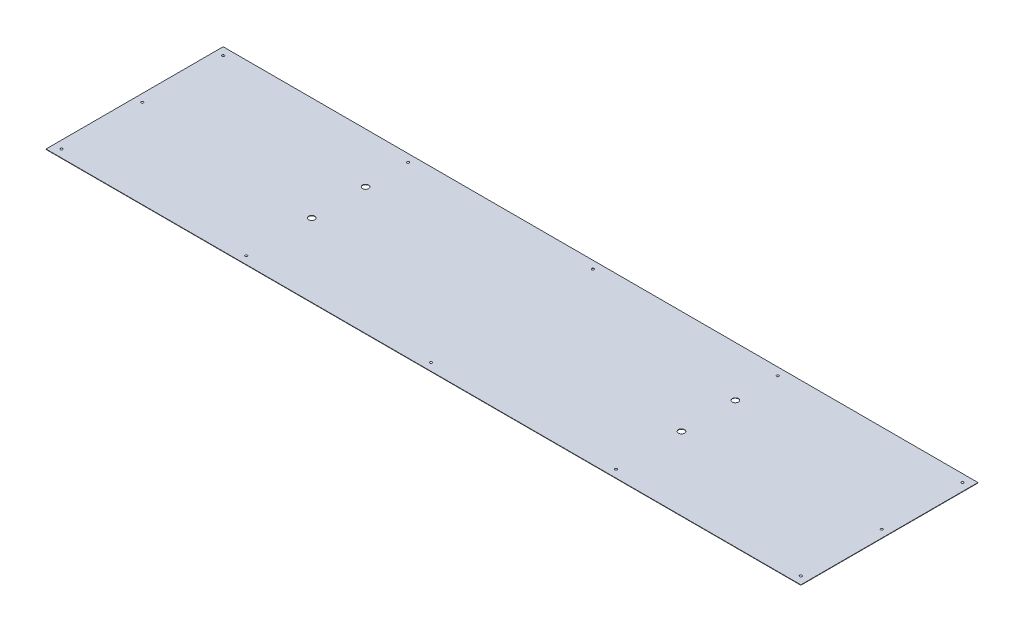
ISO-10303-21;
HEADER;
FILE_DESCRIPTION(('STEP AP214'),'2;1');
FILE_NAME('part.step','',(''),(''),'','','');
FILE_SCHEMA(('AUTOMOTIVE_DESIGN { 1 0 10303 214 1 1 1 1 }'));
ENDSEC;
DATA;
#1=APPLICATION_CONTEXT('core data for automotive mechanical design processes');
#2=APPLICATION_PROTOCOL_DEFINITION('international standard','automotive_design',2000,#1);
#3=PRODUCT_CONTEXT('',#1,'mechanical');
#4=PRODUCT('Part','Part','',(#3));
#5=PRODUCT_RELATED_PRODUCT_CATEGORY('part','',(#4));
#6=PRODUCT_DEFINITION_FORMATION('','',#4);
#7=PRODUCT_DEFINITION_CONTEXT('part definition',#1,'design');
#8=PRODUCT_DEFINITION('design','',#6,#7);
#9=PRODUCT_DEFINITION_SHAPE('','',#8);
#10=(LENGTH_UNIT() NAMED_UNIT(*) SI_UNIT(.MILLI.,.METRE.));
#11=(NAMED_UNIT(*) PLANE_ANGLE_UNIT() SI_UNIT($,.RADIAN.));
#12=(NAMED_UNIT(*) SI_UNIT($,.STERADIAN.) SOLID_ANGLE_UNIT());
#13=UNCERTAINTY_MEASURE_WITH_UNIT(LENGTH_MEASURE(1.E-05),#10,'distance_accuracy_value','');
#14=(GEOMETRIC_REPRESENTATION_CONTEXT(3) GLOBAL_UNCERTAINTY_ASSIGNED_CONTEXT((#13)) GLOBAL_UNIT_ASSIGNED_CONTEXT((#10,
#11,#12)) REPRESENTATION_CONTEXT('',''));
#15=CARTESIAN_POINT('',(0.,0.,0.));
#16=DIRECTION('',(0.,0.,1.));
#17=DIRECTION('',(1.,0.,0.));
#18=AXIS2_PLACEMENT_3D('',#15,#16,#17);
#19=CARTESIAN_POINT('',(-980.,1.,-230.));
#20=DIRECTION('',(1.,0.,0.));
#21=DIRECTION('',(0.,0.,-1.));
#22=AXIS2_PLACEMENT_3D('',#19,#20,#21);
#23=PLANE('',#22);
#24=DIRECTION('',(0.,0.,1.));
#25=VECTOR('',#24,1.);
#26=CARTESIAN_POINT('',(-980.,0.,-230.));
#27=LINE('',#26,#25);
#28=CARTESIAN_POINT('',(-980.,0.,-230.));
#29=VERTEX_POINT('',#28);
#30=CARTESIAN_POINT('',(-980.,0.,230.));
#31=VERTEX_POINT('',#30);
#32=EDGE_CURVE('E112',#29,#31,#27,.T.);
#33=ORIENTED_EDGE('',*,*,#32,.T.);
#34=DIRECTION('',(0.,-1.,0.));
#35=VECTOR('',#34,1.);
#36=CARTESIAN_POINT('',(-980.,1.,230.));
#37=LINE('',#36,#35);
#38=CARTESIAN_POINT('',(-980.,1.,230.));
#39=VERTEX_POINT('',#38);
#40=EDGE_CURVE('E101',#39,#31,#37,.T.);
#41=ORIENTED_EDGE('',*,*,#40,.F.);
#42=DIRECTION('',(0.,0.,1.));
#43=VECTOR('',#42,1.);
#44=CARTESIAN_POINT('',(-980.,1.,-230.));
#45=LINE('',#44,#43);
#46=CARTESIAN_POINT('',(-980.,1.,-230.));
#47=VERTEX_POINT('',#46);
#48=EDGE_CURVE('E93',#47,#39,#45,.T.);
#49=ORIENTED_EDGE('',*,*,#48,.F.);
#50=DIRECTION('',(0.,-1.,0.));
#51=VECTOR('',#50,1.);
#52=CARTESIAN_POINT('',(-980.,1.,-230.));
#53=LINE('',#52,#51);
#54=EDGE_CURVE('E108',#47,#29,#53,.T.);
#55=ORIENTED_EDGE('',*,*,#54,.T.);
#56=EDGE_LOOP('',(#33,#41,#49,#55));
#57=FACE_BOUND('',#56,.T.);
#58=ADVANCED_FACE('F39',(#57),#23,.F.);
#59=CARTESIAN_POINT('',(980.,1.,230.));
#60=DIRECTION('',(0.,0.,-1.));
#61=DIRECTION('',(-1.,0.,0.));
#62=AXIS2_PLACEMENT_3D('',#59,#60,#61);
#63=PLANE('',#62);
#64=DIRECTION('',(1.,0.,0.));
#65=VECTOR('',#64,1.);
#66=CARTESIAN_POINT('',(980.,0.,230.));
#67=LINE('',#66,#65);
#68=CARTESIAN_POINT('',(980.,0.,230.));
#69=VERTEX_POINT('',#68);
#70=EDGE_CURVE('E99',#31,#69,#67,.T.);
#71=ORIENTED_EDGE('',*,*,#70,.T.);
#72=DIRECTION('',(0.,-1.,0.));
#73=VECTOR('',#72,1.);
#74=CARTESIAN_POINT('',(980.,1.,230.));
#75=LINE('',#74,#73);
#76=CARTESIAN_POINT('',(980.,1.,230.));
#77=VERTEX_POINT('',#76);
#78=EDGE_CURVE('E97',#77,#69,#75,.T.);
#79=ORIENTED_EDGE('',*,*,#78,.F.);
#80=DIRECTION('',(1.,0.,0.));
#81=VECTOR('',#80,1.);
#82=CARTESIAN_POINT('',(980.,1.,230.));
#83=LINE('',#82,#81);
#84=EDGE_CURVE('E88',#39,#77,#83,.T.);
#85=ORIENTED_EDGE('',*,*,#84,.F.);
#86=ORIENTED_EDGE('',*,*,#40,.T.);
#87=EDGE_LOOP('',(#71,#79,#85,#86));
#88=FACE_BOUND('',#87,.T.);
#89=ADVANCED_FACE('F98',(#88),#63,.F.);
#90=CARTESIAN_POINT('',(980.,1.,-230.));
#91=DIRECTION('',(-1.,0.,0.));
#92=DIRECTION('',(0.,0.,1.));
#93=AXIS2_PLACEMENT_3D('',#90,#91,#92);
#94=PLANE('',#93);
#95=DIRECTION('',(0.,0.,-1.));
#96=VECTOR('',#95,1.);
#97=CARTESIAN_POINT('',(980.,0.,-230.));
#98=LINE('',#97,#96);
#99=CARTESIAN_POINT('',(980.,0.,-230.));
#100=VERTEX_POINT('',#99);
#101=EDGE_CURVE('E74',#69,#100,#98,.T.);
#102=ORIENTED_EDGE('',*,*,#101,.T.);
#103=DIRECTION('',(0.,-1.,0.));
#104=VECTOR('',#103,1.);
#105=CARTESIAN_POINT('',(980.,1.,-230.));
#106=LINE('',#105,#104);
#107=CARTESIAN_POINT('',(980.,1.,-230.));
#108=VERTEX_POINT('',#107);
#109=EDGE_CURVE('E102',#108,#100,#106,.T.);
#110=ORIENTED_EDGE('',*,*,#109,.F.);
#111=DIRECTION('',(0.,0.,-1.));
#112=VECTOR('',#111,1.);
#113=CARTESIAN_POINT('',(980.,1.,-230.));
#114=LINE('',#113,#112);
#115=EDGE_CURVE('E91',#77,#108,#114,.T.);
#116=ORIENTED_EDGE('',*,*,#115,.F.);
#117=ORIENTED_EDGE('',*,*,#78,.T.);
#118=EDGE_LOOP('',(#102,#110,#116,#117));
#119=FACE_BOUND('',#118,.T.);
#120=ADVANCED_FACE('F104',(#119),#94,.F.);
#121=CARTESIAN_POINT('',(980.,1.,-230.));
#122=DIRECTION('',(0.,0.,1.));
#123=DIRECTION('',(1.,0.,0.));
#124=AXIS2_PLACEMENT_3D('',#121,#122,#123);
#125=PLANE('',#124);
#126=DIRECTION('',(-1.,0.,0.));
#127=VECTOR('',#126,1.);
#128=CARTESIAN_POINT('',(980.,0.,-230.));
#129=LINE('',#128,#127);
#130=EDGE_CURVE('E80',#100,#29,#129,.T.);
#131=ORIENTED_EDGE('',*,*,#130,.T.);
#132=ORIENTED_EDGE('',*,*,#54,.F.);
#133=DIRECTION('',(-1.,0.,0.));
#134=VECTOR('',#133,1.);
#135=CARTESIAN_POINT('',(980.,1.,-230.));
#136=LINE('',#135,#134);
#137=EDGE_CURVE('E57',#108,#47,#136,.T.);
#138=ORIENTED_EDGE('',*,*,#137,.F.);
#139=ORIENTED_EDGE('',*,*,#109,.T.);
#140=EDGE_LOOP('',(#131,#132,#138,#139));
#141=FACE_BOUND('',#140,.T.);
#142=ADVANCED_FACE('F202',(#141),#125,.F.);
#143=CARTESIAN_POINT('',(0.,1.,0.));
#144=DIRECTION('',(0.,-1.,0.));
#145=DIRECTION('',(0.,0.,-1.));
#146=AXIS2_PLACEMENT_3D('',#143,#144,#145);
#147=PLANE('',#146);
#148=CARTESIAN_POINT('',(-960.,1.,210.));
#149=DIRECTION('',(0.,1.,0.));
#150=DIRECTION('',(0.,0.,1.));
#151=AXIS2_PLACEMENT_3D('',#148,#149,#150);
#152=CIRCLE('',#151,3.00000000000005);
#153=CARTESIAN_POINT('',(-960.,1.,213.));
#154=VERTEX_POINT('',#153);
#155=EDGE_CURVE('E262',#154,#154,#152,.T.);
#156=ORIENTED_EDGE('',*,*,#155,.F.);
#157=EDGE_LOOP('',(#156));
#158=FACE_BOUND('',#157,.T.);
#159=CARTESIAN_POINT('',(-960.,1.,-210.));
#160=DIRECTION('',(0.,1.,0.));
#161=DIRECTION('',(0.,0.,1.));
#162=AXIS2_PLACEMENT_3D('',#159,#160,#161);
#163=CIRCLE('',#162,3.00000000000005);
#164=CARTESIAN_POINT('',(-960.,1.,-207.));
#165=VERTEX_POINT('',#164);
#166=EDGE_CURVE('E280',#165,#165,#163,.T.);
#167=ORIENTED_EDGE('',*,*,#166,.F.);
#168=EDGE_LOOP('',(#167));
#169=FACE_BOUND('',#168,.T.);
#170=CARTESIAN_POINT('',(960.,1.,-210.));
#171=DIRECTION('',(0.,1.,0.));
#172=DIRECTION('',(0.,0.,1.));
#173=AXIS2_PLACEMENT_3D('',#170,#171,#172);
#174=CIRCLE('',#173,3.00000000000005);
#175=CARTESIAN_POINT('',(960.,1.,-207.));
#176=VERTEX_POINT('',#175);
#177=EDGE_CURVE('E285',#176,#176,#174,.T.);
#178=ORIENTED_EDGE('',*,*,#177,.F.);
#179=EDGE_LOOP('',(#178));
#180=FACE_BOUND('',#179,.T.);
#181=CARTESIAN_POINT('',(-960.,1.,0.));
#182=DIRECTION('',(0.,1.,0.));
#183=DIRECTION('',(0.,0.,1.));
#184=AXIS2_PLACEMENT_3D('',#181,#182,#183);
#185=CIRCLE('',#184,3.00000000000005);
#186=CARTESIAN_POINT('',(-960.,1.,3.00000000000002));
#187=VERTEX_POINT('',#186);
#188=EDGE_CURVE('E287',#187,#187,#185,.T.);
#189=ORIENTED_EDGE('',*,*,#188,.F.);
#190=EDGE_LOOP('',(#189));
#191=FACE_BOUND('',#190,.T.);
#192=CARTESIAN_POINT('',(960.,1.,210.));
#193=DIRECTION('',(0.,1.,0.));
#194=DIRECTION('',(0.,0.,1.));
#195=AXIS2_PLACEMENT_3D('',#192,#193,#194);
#196=CIRCLE('',#195,3.00000000000005);
#197=CARTESIAN_POINT('',(960.,1.,213.));
#198=VERTEX_POINT('',#197);
#199=EDGE_CURVE('E258',#198,#198,#196,.T.);
#200=ORIENTED_EDGE('',*,*,#199,.F.);
#201=EDGE_LOOP('',(#200));
#202=FACE_BOUND('',#201,.T.);
#203=CARTESIAN_POINT('',(480.,1.,-99.9999999999999));
#204=DIRECTION('',(0.,1.,0.));
#205=DIRECTION('',(0.,0.,1.));
#206=AXIS2_PLACEMENT_3D('',#203,#204,#205);
#207=CIRCLE('',#206,7.99999999999999);
#208=CARTESIAN_POINT('',(480.,1.,-91.9999999999999));
#209=VERTEX_POINT('',#208);
#210=EDGE_CURVE('E254',#209,#209,#207,.T.);
#211=ORIENTED_EDGE('',*,*,#210,.F.);
#212=EDGE_LOOP('',(#211));
#213=FACE_BOUND('',#212,.T.);
#214=CARTESIAN_POINT('',(-480.,1.,-99.9999999999999));
#215=DIRECTION('',(0.,1.,0.));
#216=DIRECTION('',(0.,0.,1.));
#217=AXIS2_PLACEMENT_3D('',#214,#215,#216);
#218=CIRCLE('',#217,7.99999999999999);
#219=CARTESIAN_POINT('',(-480.,1.,-91.9999999999999));
#220=VERTEX_POINT('',#219);
#221=EDGE_CURVE('E243',#220,#220,#218,.T.);
#222=ORIENTED_EDGE('',*,*,#221,.F.);
#223=EDGE_LOOP('',(#222));
#224=FACE_BOUND('',#223,.T.);
#225=CARTESIAN_POINT('',(-480.,1.,40.0000000000001));
#226=DIRECTION('',(0.,1.,0.));
#227=DIRECTION('',(0.,0.,1.));
#228=AXIS2_PLACEMENT_3D('',#225,#226,#227);
#229=CIRCLE('',#228,7.99999999999998);
#230=CARTESIAN_POINT('',(-480.,1.,48.));
#231=VERTEX_POINT('',#230);
#232=EDGE_CURVE('E233',#231,#231,#229,.T.);
#233=ORIENTED_EDGE('',*,*,#232,.F.);
#234=EDGE_LOOP('',(#233));
#235=FACE_BOUND('',#234,.T.);
#236=CARTESIAN_POINT('',(480.,1.,-210.));
#237=DIRECTION('',(0.,1.,0.));
#238=DIRECTION('',(0.,0.,1.));
#239=AXIS2_PLACEMENT_3D('',#236,#237,#238);
#240=CIRCLE('',#239,2.99999999999999);
#241=CARTESIAN_POINT('',(480.,1.,-207.));
#242=VERTEX_POINT('',#241);
#243=EDGE_CURVE('E311',#242,#242,#240,.T.);
#244=ORIENTED_EDGE('',*,*,#243,.F.);
#245=EDGE_LOOP('',(#244));
#246=FACE_BOUND('',#245,.T.);
#247=CARTESIAN_POINT('',(-480.,1.,-210.));
#248=DIRECTION('',(0.,1.,0.));
#249=DIRECTION('',(0.,0.,1.));
#250=AXIS2_PLACEMENT_3D('',#247,#248,#249);
#251=CIRCLE('',#250,2.99999999999999);
#252=CARTESIAN_POINT('',(-480.,1.,-207.));
#253=VERTEX_POINT('',#252);
#254=EDGE_CURVE('E315',#253,#253,#251,.T.);
#255=ORIENTED_EDGE('',*,*,#254,.F.);
#256=EDGE_LOOP('',(#255));
#257=FACE_BOUND('',#256,.T.);
#258=CARTESIAN_POINT('',(-480.,1.,210.));
#259=DIRECTION('',(0.,1.,0.));
#260=DIRECTION('',(0.,0.,1.));
#261=AXIS2_PLACEMENT_3D('',#258,#259,#260);
#262=CIRCLE('',#261,2.99999999999999);
#263=CARTESIAN_POINT('',(-480.,1.,213.));
#264=VERTEX_POINT('',#263);
#265=EDGE_CURVE('E307',#264,#264,#262,.T.);
#266=ORIENTED_EDGE('',*,*,#265,.F.);
#267=EDGE_LOOP('',(#266));
#268=FACE_BOUND('',#267,.T.);
#269=CARTESIAN_POINT('',(960.,1.,0.));
#270=DIRECTION('',(0.,1.,0.));
#271=DIRECTION('',(0.,0.,1.));
#272=AXIS2_PLACEMENT_3D('',#269,#270,#271);
#273=CIRCLE('',#272,3.00000000000005);
#274=CARTESIAN_POINT('',(960.,1.,3.00000000000005));
#275=VERTEX_POINT('',#274);
#276=EDGE_CURVE('E291',#275,#275,#273,.T.);
#277=ORIENTED_EDGE('',*,*,#276,.F.);
#278=EDGE_LOOP('',(#277));
#279=FACE_BOUND('',#278,.T.);
#280=CARTESIAN_POINT('',(-2.22044604925031E-13,1.,210.));
#281=DIRECTION('',(0.,1.,0.));
#282=DIRECTION('',(0.,0.,1.));
#283=AXIS2_PLACEMENT_3D('',#280,#281,#282);
#284=CIRCLE('',#283,3.);
#285=CARTESIAN_POINT('',(-2.22044604925031E-13,1.,213.));
#286=VERTEX_POINT('',#285);
#287=EDGE_CURVE('E295',#286,#286,#284,.T.);
#288=ORIENTED_EDGE('',*,*,#287,.F.);
#289=EDGE_LOOP('',(#288));
#290=FACE_BOUND('',#289,.T.);
#291=CARTESIAN_POINT('',(-1.11022302462516E-13,1.,-210.));
#292=DIRECTION('',(0.,1.,0.));
#293=DIRECTION('',(0.,0.,1.));
#294=AXIS2_PLACEMENT_3D('',#291,#292,#293);
#295=CIRCLE('',#294,3.);
#296=CARTESIAN_POINT('',(-1.11022302462516E-13,1.,-207.));
#297=VERTEX_POINT('',#296);
#298=EDGE_CURVE('E299',#297,#297,#295,.T.);
#299=ORIENTED_EDGE('',*,*,#298,.F.);
#300=EDGE_LOOP('',(#299));
#301=FACE_BOUND('',#300,.T.);
#302=CARTESIAN_POINT('',(480.,1.,210.));
#303=DIRECTION('',(0.,1.,0.));
#304=DIRECTION('',(0.,0.,1.));
#305=AXIS2_PLACEMENT_3D('',#302,#303,#304);
#306=CIRCLE('',#305,2.99999999999999);
#307=CARTESIAN_POINT('',(480.,1.,213.));
#308=VERTEX_POINT('',#307);
#309=EDGE_CURVE('E303',#308,#308,#306,.T.);
#310=ORIENTED_EDGE('',*,*,#309,.F.);
#311=EDGE_LOOP('',(#310));
#312=FACE_BOUND('',#311,.T.);
#313=CARTESIAN_POINT('',(480.,1.,39.9999999999999));
#314=DIRECTION('',(0.,1.,0.));
#315=DIRECTION('',(0.,0.,1.));
#316=AXIS2_PLACEMENT_3D('',#313,#314,#315);
#317=CIRCLE('',#316,7.99999999999998);
#318=CARTESIAN_POINT('',(480.,1.,47.9999999999999));
#319=VERTEX_POINT('',#318);
#320=EDGE_CURVE('E240',#319,#319,#317,.T.);
#321=ORIENTED_EDGE('',*,*,#320,.F.);
#322=EDGE_LOOP('',(#321));
#323=FACE_BOUND('',#322,.T.);
#324=ORIENTED_EDGE('',*,*,#48,.T.);
#325=ORIENTED_EDGE('',*,*,#84,.T.);
#326=ORIENTED_EDGE('',*,*,#115,.T.);
#327=ORIENTED_EDGE('',*,*,#137,.T.);
#328=EDGE_LOOP('',(#324,#325,#326,#327));
#329=FACE_BOUND('',#328,.T.);
#330=ADVANCED_FACE('F89',(#158,#169,#180,#191,#202,#213,#224,#235,#246,#257,#268,#279,#290,#301,
#312,#323,#329),#147,.F.);
#331=CARTESIAN_POINT('',(0.,0.,0.));
#332=DIRECTION('',(0.,-1.,0.));
#333=DIRECTION('',(0.,0.,-1.));
#334=AXIS2_PLACEMENT_3D('',#331,#332,#333);
#335=PLANE('',#334);
#336=CARTESIAN_POINT('',(-960.,0.,0.));
#337=DIRECTION('',(0.,-1.,0.));
#338=DIRECTION('',(0.,0.,-1.));
#339=AXIS2_PLACEMENT_3D('',#336,#337,#338);
#340=CIRCLE('',#339,3.99999999999978);
#341=CARTESIAN_POINT('',(-960.,0.,-3.99999999999981));
#342=VERTEX_POINT('',#341);
#343=EDGE_CURVE('E11',#342,#342,#340,.F.);
#344=ORIENTED_EDGE('',*,*,#343,.T.);
#345=EDGE_LOOP('',(#344));
#346=FACE_BOUND('',#345,.T.);
#347=CARTESIAN_POINT('',(-960.,0.,-210.));
#348=DIRECTION('',(0.,-1.,0.));
#349=DIRECTION('',(0.,0.,-1.));
#350=AXIS2_PLACEMENT_3D('',#347,#348,#349);
#351=CIRCLE('',#350,4.);
#352=CARTESIAN_POINT('',(-960.,0.,-214.));
#353=VERTEX_POINT('',#352);
#354=EDGE_CURVE('E49',#353,#353,#351,.F.);
#355=ORIENTED_EDGE('',*,*,#354,.T.);
#356=EDGE_LOOP('',(#355));
#357=FACE_BOUND('',#356,.T.);
#358=CARTESIAN_POINT('',(-480.,0.,-210.));
#359=DIRECTION('',(0.,-1.,0.));
#360=DIRECTION('',(0.,0.,-1.));
#361=AXIS2_PLACEMENT_3D('',#358,#359,#360);
#362=CIRCLE('',#361,3.99999999999956);
#363=CARTESIAN_POINT('',(-480.,0.,-214.));
#364=VERTEX_POINT('',#363);
#365=EDGE_CURVE('E165',#364,#364,#362,.F.);
#366=ORIENTED_EDGE('',*,*,#365,.T.);
#367=EDGE_LOOP('',(#366));
#368=FACE_BOUND('',#367,.T.);
#369=CARTESIAN_POINT('',(-1.11022302462516E-13,0.,-210.));
#370=DIRECTION('',(0.,-1.,0.));
#371=DIRECTION('',(0.,0.,-1.));
#372=AXIS2_PLACEMENT_3D('',#369,#370,#371);
#373=CIRCLE('',#372,4.);
#374=CARTESIAN_POINT('',(-1.11022302462516E-13,0.,-214.));
#375=VERTEX_POINT('',#374);
#376=EDGE_CURVE('E161',#375,#375,#373,.F.);
#377=ORIENTED_EDGE('',*,*,#376,.T.);
#378=EDGE_LOOP('',(#377));
#379=FACE_BOUND('',#378,.T.);
#380=CARTESIAN_POINT('',(480.,0.,-210.));
#381=DIRECTION('',(0.,-1.,0.));
#382=DIRECTION('',(0.,0.,-1.));
#383=AXIS2_PLACEMENT_3D('',#380,#381,#382);
#384=CIRCLE('',#383,3.99999999999956);
#385=CARTESIAN_POINT('',(480.,0.,-214.));
#386=VERTEX_POINT('',#385);
#387=EDGE_CURVE('E157',#386,#386,#384,.F.);
#388=ORIENTED_EDGE('',*,*,#387,.T.);
#389=EDGE_LOOP('',(#388));
#390=FACE_BOUND('',#389,.T.);
#391=CARTESIAN_POINT('',(960.,0.,-210.));
#392=DIRECTION('',(0.,-1.,0.));
#393=DIRECTION('',(0.,0.,-1.));
#394=AXIS2_PLACEMENT_3D('',#391,#392,#393);
#395=CIRCLE('',#394,4.);
#396=CARTESIAN_POINT('',(960.,0.,-214.));
#397=VERTEX_POINT('',#396);
#398=EDGE_CURVE('E153',#397,#397,#395,.F.);
#399=ORIENTED_EDGE('',*,*,#398,.T.);
#400=EDGE_LOOP('',(#399));
#401=FACE_BOUND('',#400,.T.);
#402=CARTESIAN_POINT('',(960.,0.,0.));
#403=DIRECTION('',(0.,-1.,0.));
#404=DIRECTION('',(0.,0.,-1.));
#405=AXIS2_PLACEMENT_3D('',#402,#403,#404);
#406=CIRCLE('',#405,3.99999999999978);
#407=CARTESIAN_POINT('',(960.,0.,-3.99999999999978));
#408=VERTEX_POINT('',#407);
#409=EDGE_CURVE('E149',#408,#408,#406,.F.);
#410=ORIENTED_EDGE('',*,*,#409,.T.);
#411=EDGE_LOOP('',(#410));
#412=FACE_BOUND('',#411,.T.);
#413=CARTESIAN_POINT('',(960.,0.,210.));
#414=DIRECTION('',(0.,-1.,0.));
#415=DIRECTION('',(0.,0.,-1.));
#416=AXIS2_PLACEMENT_3D('',#413,#414,#415);
#417=CIRCLE('',#416,4.);
#418=CARTESIAN_POINT('',(960.,0.,206.));
#419=VERTEX_POINT('',#418);
#420=EDGE_CURVE('E145',#419,#419,#417,.F.);
#421=ORIENTED_EDGE('',*,*,#420,.T.);
#422=EDGE_LOOP('',(#421));
#423=FACE_BOUND('',#422,.T.);
#424=CARTESIAN_POINT('',(480.,0.,210.));
#425=DIRECTION('',(0.,-1.,0.));
#426=DIRECTION('',(0.,0.,-1.));
#427=AXIS2_PLACEMENT_3D('',#424,#425,#426);
#428=CIRCLE('',#427,4.00000000000023);
#429=CARTESIAN_POINT('',(480.,0.,206.));
#430=VERTEX_POINT('',#429);
#431=EDGE_CURVE('E141',#430,#430,#428,.F.);
#432=ORIENTED_EDGE('',*,*,#431,.T.);
#433=EDGE_LOOP('',(#432));
#434=FACE_BOUND('',#433,.T.);
#435=CARTESIAN_POINT('',(-2.22044604925031E-13,0.,210.));
#436=DIRECTION('',(0.,-1.,0.));
#437=DIRECTION('',(0.,0.,-1.));
#438=AXIS2_PLACEMENT_3D('',#435,#436,#437);
#439=CIRCLE('',#438,4.);
#440=CARTESIAN_POINT('',(-2.22044604925031E-13,0.,206.));
#441=VERTEX_POINT('',#440);
#442=EDGE_CURVE('E137',#441,#441,#439,.F.);
#443=ORIENTED_EDGE('',*,*,#442,.T.);
#444=EDGE_LOOP('',(#443));
#445=FACE_BOUND('',#444,.T.);
#446=CARTESIAN_POINT('',(-480.,0.,210.));
#447=DIRECTION('',(0.,-1.,0.));
#448=DIRECTION('',(0.,0.,-1.));
#449=AXIS2_PLACEMENT_3D('',#446,#447,#448);
#450=CIRCLE('',#449,4.00000000000023);
#451=CARTESIAN_POINT('',(-480.,0.,206.));
#452=VERTEX_POINT('',#451);
#453=EDGE_CURVE('E133',#452,#452,#450,.F.);
#454=ORIENTED_EDGE('',*,*,#453,.T.);
#455=EDGE_LOOP('',(#454));
#456=FACE_BOUND('',#455,.T.);
#457=CARTESIAN_POINT('',(-960.,0.,210.));
#458=DIRECTION('',(0.,-1.,0.));
#459=DIRECTION('',(0.,0.,-1.));
#460=AXIS2_PLACEMENT_3D('',#457,#458,#459);
#461=CIRCLE('',#460,4.);
#462=CARTESIAN_POINT('',(-960.,0.,206.));
#463=VERTEX_POINT('',#462);
#464=EDGE_CURVE('E129',#463,#463,#461,.F.);
#465=ORIENTED_EDGE('',*,*,#464,.T.);
#466=EDGE_LOOP('',(#465));
#467=FACE_BOUND('',#466,.T.);
#468=CARTESIAN_POINT('',(480.,0.,-99.9999999999999));
#469=DIRECTION('',(0.,1.,0.));
#470=DIRECTION('',(0.,0.,1.));
#471=AXIS2_PLACEMENT_3D('',#468,#469,#470);
#472=CIRCLE('',#471,7.99999999999999);
#473=CARTESIAN_POINT('',(480.,0.,-91.9999999999999));
#474=VERTEX_POINT('',#473);
#475=EDGE_CURVE('E250',#474,#474,#472,.T.);
#476=ORIENTED_EDGE('',*,*,#475,.T.);
#477=EDGE_LOOP('',(#476));
#478=FACE_BOUND('',#477,.T.);
#479=CARTESIAN_POINT('',(-480.,0.,-99.9999999999999));
#480=DIRECTION('',(0.,1.,0.));
#481=DIRECTION('',(0.,0.,1.));
#482=AXIS2_PLACEMENT_3D('',#479,#480,#481);
#483=CIRCLE('',#482,7.99999999999999);
#484=CARTESIAN_POINT('',(-480.,0.,-91.9999999999999));
#485=VERTEX_POINT('',#484);
#486=EDGE_CURVE('E236',#485,#485,#483,.T.);
#487=ORIENTED_EDGE('',*,*,#486,.T.);
#488=EDGE_LOOP('',(#487));
#489=FACE_BOUND('',#488,.T.);
#490=CARTESIAN_POINT('',(-480.,0.,40.0000000000001));
#491=DIRECTION('',(0.,1.,0.));
#492=DIRECTION('',(0.,0.,1.));
#493=AXIS2_PLACEMENT_3D('',#490,#491,#492);
#494=CIRCLE('',#493,7.99999999999998);
#495=CARTESIAN_POINT('',(-480.,0.,48.));
#496=VERTEX_POINT('',#495);
#497=EDGE_CURVE('E230',#496,#496,#494,.T.);
#498=ORIENTED_EDGE('',*,*,#497,.T.);
#499=EDGE_LOOP('',(#498));
#500=FACE_BOUND('',#499,.T.);
#501=CARTESIAN_POINT('',(480.,0.,39.9999999999999));
#502=DIRECTION('',(0.,1.,0.));
#503=DIRECTION('',(0.,0.,1.));
#504=AXIS2_PLACEMENT_3D('',#501,#502,#503);
#505=CIRCLE('',#504,7.99999999999998);
#506=CARTESIAN_POINT('',(480.,0.,47.9999999999999));
#507=VERTEX_POINT('',#506);
#508=EDGE_CURVE('E116',#507,#507,#505,.T.);
#509=ORIENTED_EDGE('',*,*,#508,.T.);
#510=EDGE_LOOP('',(#509));
#511=FACE_BOUND('',#510,.T.);
#512=ORIENTED_EDGE('',*,*,#32,.F.);
#513=ORIENTED_EDGE('',*,*,#130,.F.);
#514=ORIENTED_EDGE('',*,*,#101,.F.);
#515=ORIENTED_EDGE('',*,*,#70,.F.);
#516=EDGE_LOOP('',(#512,#513,#514,#515));
#517=FACE_BOUND('',#516,.T.);
#518=ADVANCED_FACE('F172',(#346,#357,#368,#379,#390,#401,#412,#423,#434,#445,#456,#467,#478,
#489,#500,#511,#517),#335,.T.);
#519=CARTESIAN_POINT('',(480.,0.,39.9999999999999));
#520=DIRECTION('',(0.,1.,0.));
#521=DIRECTION('',(0.,0.,1.));
#522=AXIS2_PLACEMENT_3D('',#519,#520,#521);
#523=CYLINDRICAL_SURFACE('',#522,7.99999999999998);
#524=ORIENTED_EDGE('',*,*,#508,.F.);
#525=EDGE_LOOP('',(#524));
#526=FACE_BOUND('',#525,.T.);
#527=ORIENTED_EDGE('',*,*,#320,.T.);
#528=EDGE_LOOP('',(#527));
#529=FACE_BOUND('',#528,.T.);
#530=ADVANCED_FACE('F207',(#526,#529),#523,.F.);
#531=CARTESIAN_POINT('',(-480.,0.,40.0000000000001));
#532=DIRECTION('',(0.,1.,0.));
#533=DIRECTION('',(0.,0.,1.));
#534=AXIS2_PLACEMENT_3D('',#531,#532,#533);
#535=CYLINDRICAL_SURFACE('',#534,7.99999999999998);
#536=ORIENTED_EDGE('',*,*,#497,.F.);
#537=EDGE_LOOP('',(#536));
#538=FACE_BOUND('',#537,.T.);
#539=ORIENTED_EDGE('',*,*,#232,.T.);
#540=EDGE_LOOP('',(#539));
#541=FACE_BOUND('',#540,.T.);
#542=ADVANCED_FACE('F214',(#538,#541),#535,.F.);
#543=CARTESIAN_POINT('',(-480.,0.,-99.9999999999999));
#544=DIRECTION('',(0.,1.,0.));
#545=DIRECTION('',(0.,0.,1.));
#546=AXIS2_PLACEMENT_3D('',#543,#544,#545);
#547=CYLINDRICAL_SURFACE('',#546,7.99999999999999);
#548=ORIENTED_EDGE('',*,*,#486,.F.);
#549=EDGE_LOOP('',(#548));
#550=FACE_BOUND('',#549,.T.);
#551=ORIENTED_EDGE('',*,*,#221,.T.);
#552=EDGE_LOOP('',(#551));
#553=FACE_BOUND('',#552,.T.);
#554=ADVANCED_FACE('F218',(#550,#553),#547,.F.);
#555=CARTESIAN_POINT('',(480.,0.,-99.9999999999999));
#556=DIRECTION('',(0.,1.,0.));
#557=DIRECTION('',(0.,0.,1.));
#558=AXIS2_PLACEMENT_3D('',#555,#556,#557);
#559=CYLINDRICAL_SURFACE('',#558,7.99999999999999);
#560=ORIENTED_EDGE('',*,*,#475,.F.);
#561=EDGE_LOOP('',(#560));
#562=FACE_BOUND('',#561,.T.);
#563=ORIENTED_EDGE('',*,*,#210,.T.);
#564=EDGE_LOOP('',(#563));
#565=FACE_BOUND('',#564,.T.);
#566=ADVANCED_FACE('F188',(#562,#565),#559,.F.);
#567=CARTESIAN_POINT('',(-960.,0.,0.));
#568=DIRECTION('',(0.,-1.,0.));
#569=DIRECTION('',(0.,0.,-1.));
#570=AXIS2_PLACEMENT_3D('',#567,#568,#569);
#571=CONICAL_SURFACE('',#570,3.99999999999978,0.785398163397342);
#572=ORIENTED_EDGE('',*,*,#188,.T.);
#573=EDGE_LOOP('',(#572));
#574=FACE_BOUND('',#573,.T.);
#575=ORIENTED_EDGE('',*,*,#343,.F.);
#576=EDGE_LOOP('',(#575));
#577=FACE_BOUND('',#576,.T.);
#578=ADVANCED_FACE('F178',(#574,#577),#571,.F.);
#579=CARTESIAN_POINT('',(-960.,0.,-210.));
#580=DIRECTION('',(0.,-1.,0.));
#581=DIRECTION('',(0.,0.,-1.));
#582=AXIS2_PLACEMENT_3D('',#579,#580,#581);
#583=CONICAL_SURFACE('',#582,4.,0.785398163397554);
#584=ORIENTED_EDGE('',*,*,#166,.T.);
#585=EDGE_LOOP('',(#584));
#586=FACE_BOUND('',#585,.T.);
#587=ORIENTED_EDGE('',*,*,#354,.F.);
#588=EDGE_LOOP('',(#587));
#589=FACE_BOUND('',#588,.T.);
#590=ADVANCED_FACE('F175',(#586,#589),#583,.F.);
#591=CARTESIAN_POINT('',(-480.,0.,-210.));
#592=DIRECTION('',(0.,-1.,0.));
#593=DIRECTION('',(0.,0.,-1.));
#594=AXIS2_PLACEMENT_3D('',#591,#592,#593);
#595=CONICAL_SURFACE('',#594,3.99999999999956,0.785398163397554);
#596=ORIENTED_EDGE('',*,*,#254,.T.);
#597=EDGE_LOOP('',(#596));
#598=FACE_BOUND('',#597,.T.);
#599=ORIENTED_EDGE('',*,*,#365,.F.);
#600=EDGE_LOOP('',(#599));
#601=FACE_BOUND('',#600,.T.);
#602=ADVANCED_FACE('F177',(#598,#601),#595,.F.);
#603=CARTESIAN_POINT('',(-1.11022302462516E-13,0.,-210.));
#604=DIRECTION('',(0.,-1.,0.));
#605=DIRECTION('',(0.,0.,-1.));
#606=AXIS2_PLACEMENT_3D('',#603,#604,#605);
#607=CONICAL_SURFACE('',#606,4.,0.785398163397554);
#608=ORIENTED_EDGE('',*,*,#298,.T.);
#609=EDGE_LOOP('',(#608));
#610=FACE_BOUND('',#609,.T.);
#611=ORIENTED_EDGE('',*,*,#376,.F.);
#612=EDGE_LOOP('',(#611));
#613=FACE_BOUND('',#612,.T.);
#614=ADVANCED_FACE('F185',(#610,#613),#607,.F.);
#615=CARTESIAN_POINT('',(480.,0.,-210.));
#616=DIRECTION('',(0.,-1.,0.));
#617=DIRECTION('',(0.,0.,-1.));
#618=AXIS2_PLACEMENT_3D('',#615,#616,#617);
#619=CONICAL_SURFACE('',#618,3.99999999999956,0.785398163397554);
#620=ORIENTED_EDGE('',*,*,#243,.T.);
#621=EDGE_LOOP('',(#620));
#622=FACE_BOUND('',#621,.T.);
#623=ORIENTED_EDGE('',*,*,#387,.F.);
#624=EDGE_LOOP('',(#623));
#625=FACE_BOUND('',#624,.T.);
#626=ADVANCED_FACE('F429',(#622,#625),#619,.F.);
#627=CARTESIAN_POINT('',(960.,0.,-210.));
#628=DIRECTION('',(0.,-1.,0.));
#629=DIRECTION('',(0.,0.,-1.));
#630=AXIS2_PLACEMENT_3D('',#627,#628,#629);
#631=CONICAL_SURFACE('',#630,4.,0.785398163397554);
#632=ORIENTED_EDGE('',*,*,#177,.T.);
#633=EDGE_LOOP('',(#632));
#634=FACE_BOUND('',#633,.T.);
#635=ORIENTED_EDGE('',*,*,#398,.F.);
#636=EDGE_LOOP('',(#635));
#637=FACE_BOUND('',#636,.T.);
#638=ADVANCED_FACE('F380',(#634,#637),#631,.F.);
#639=CARTESIAN_POINT('',(960.,0.,0.));
#640=DIRECTION('',(0.,-1.,0.));
#641=DIRECTION('',(0.,0.,-1.));
#642=AXIS2_PLACEMENT_3D('',#639,#640,#641);
#643=CONICAL_SURFACE('',#642,3.99999999999978,0.785398163397342);
#644=ORIENTED_EDGE('',*,*,#276,.T.);
#645=EDGE_LOOP('',(#644));
#646=FACE_BOUND('',#645,.T.);
#647=ORIENTED_EDGE('',*,*,#409,.F.);
#648=EDGE_LOOP('',(#647));
#649=FACE_BOUND('',#648,.T.);
#650=ADVANCED_FACE('F375',(#646,#649),#643,.F.);
#651=CARTESIAN_POINT('',(960.,0.,210.));
#652=DIRECTION('',(0.,-1.,0.));
#653=DIRECTION('',(0.,0.,-1.));
#654=AXIS2_PLACEMENT_3D('',#651,#652,#653);
#655=CONICAL_SURFACE('',#654,4.,0.785398163397554);
#656=ORIENTED_EDGE('',*,*,#199,.T.);
#657=EDGE_LOOP('',(#656));
#658=FACE_BOUND('',#657,.T.);
#659=ORIENTED_EDGE('',*,*,#420,.F.);
#660=EDGE_LOOP('',(#659));
#661=FACE_BOUND('',#660,.T.);
#662=ADVANCED_FACE('F339',(#658,#661),#655,.F.);
#663=CARTESIAN_POINT('',(480.,0.,210.));
#664=DIRECTION('',(0.,-1.,0.));
#665=DIRECTION('',(0.,0.,-1.));
#666=AXIS2_PLACEMENT_3D('',#663,#664,#665);
#667=CONICAL_SURFACE('',#666,4.00000000000023,0.785398163397554);
#668=ORIENTED_EDGE('',*,*,#309,.T.);
#669=EDGE_LOOP('',(#668));
#670=FACE_BOUND('',#669,.T.);
#671=ORIENTED_EDGE('',*,*,#431,.F.);
#672=EDGE_LOOP('',(#671));
#673=FACE_BOUND('',#672,.T.);
#674=ADVANCED_FACE('F335',(#670,#673),#667,.F.);
#675=CARTESIAN_POINT('',(-2.22044604925031E-13,0.,210.));
#676=DIRECTION('',(0.,-1.,0.));
#677=DIRECTION('',(0.,0.,-1.));
#678=AXIS2_PLACEMENT_3D('',#675,#676,#677);
#679=CONICAL_SURFACE('',#678,4.,0.785398163397554);
#680=ORIENTED_EDGE('',*,*,#287,.T.);
#681=EDGE_LOOP('',(#680));
#682=FACE_BOUND('',#681,.T.);
#683=ORIENTED_EDGE('',*,*,#442,.F.);
#684=EDGE_LOOP('',(#683));
#685=FACE_BOUND('',#684,.T.);
#686=ADVANCED_FACE('F338',(#682,#685),#679,.F.);
#687=CARTESIAN_POINT('',(-480.,0.,210.));
#688=DIRECTION('',(0.,-1.,0.));
#689=DIRECTION('',(0.,0.,-1.));
#690=AXIS2_PLACEMENT_3D('',#687,#688,#689);
#691=CONICAL_SURFACE('',#690,4.00000000000023,0.785398163397554);
#692=ORIENTED_EDGE('',*,*,#265,.T.);
#693=EDGE_LOOP('',(#692));
#694=FACE_BOUND('',#693,.T.);
#695=ORIENTED_EDGE('',*,*,#453,.F.);
#696=EDGE_LOOP('',(#695));
#697=FACE_BOUND('',#696,.T.);
#698=ADVANCED_FACE('F323',(#694,#697),#691,.F.);
#699=CARTESIAN_POINT('',(-960.,0.,210.));
#700=DIRECTION('',(0.,-1.,0.));
#701=DIRECTION('',(0.,0.,-1.));
#702=AXIS2_PLACEMENT_3D('',#699,#700,#701);
#703=CONICAL_SURFACE('',#702,4.,0.785398163397554);
#704=ORIENTED_EDGE('',*,*,#155,.T.);
#705=EDGE_LOOP('',(#704));
#706=FACE_BOUND('',#705,.T.);
#707=ORIENTED_EDGE('',*,*,#464,.F.);
#708=EDGE_LOOP('',(#707));
#709=FACE_BOUND('',#708,.T.);
#710=ADVANCED_FACE('F41',(#706,#709),#703,.F.);
#711=CLOSED_SHELL('',(#58,#89,#120,#142,#330,#518,#530,#542,#554,#566,#578,#590,#602,#614,#626,
#638,#650,#662,#674,#686,#698,#710));
#712=MANIFOLD_SOLID_BREP('B2',#711);
#713=ADVANCED_BREP_SHAPE_REPRESENTATION('',(#18,#712),#14);
#714=SHAPE_DEFINITION_REPRESENTATION(#9,#713);
ENDSEC;
END-ISO-10303-21;
